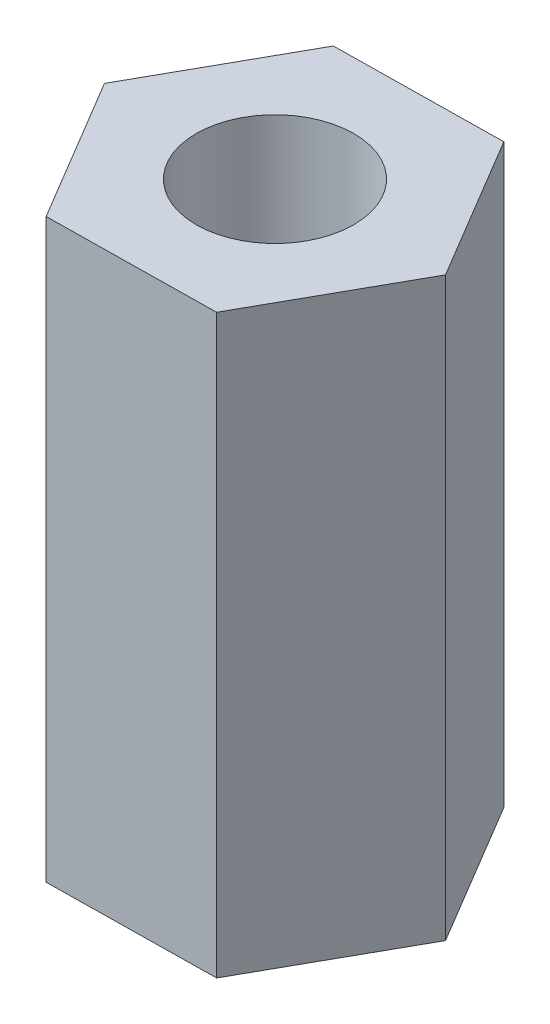
ISO-10303-21;
HEADER;
FILE_DESCRIPTION(('STEP AP214'),'2;1');
FILE_NAME('part.step','',(''),(''),'','','');
FILE_SCHEMA(('AUTOMOTIVE_DESIGN { 1 0 10303 214 1 1 1 1 }'));
ENDSEC;
DATA;
#1=APPLICATION_CONTEXT('core data for automotive mechanical design processes');
#2=APPLICATION_PROTOCOL_DEFINITION('international standard','automotive_design',2000,#1);
#3=PRODUCT_CONTEXT('',#1,'mechanical');
#4=PRODUCT('Part','Part','',(#3));
#5=PRODUCT_RELATED_PRODUCT_CATEGORY('part','',(#4));
#6=PRODUCT_DEFINITION_FORMATION('','',#4);
#7=PRODUCT_DEFINITION_CONTEXT('part definition',#1,'design');
#8=PRODUCT_DEFINITION('design','',#6,#7);
#9=PRODUCT_DEFINITION_SHAPE('','',#8);
#10=(LENGTH_UNIT() NAMED_UNIT(*) SI_UNIT(.MILLI.,.METRE.));
#11=(NAMED_UNIT(*) PLANE_ANGLE_UNIT() SI_UNIT($,.RADIAN.));
#12=(NAMED_UNIT(*) SI_UNIT($,.STERADIAN.) SOLID_ANGLE_UNIT());
#13=UNCERTAINTY_MEASURE_WITH_UNIT(LENGTH_MEASURE(1.E-05),#10,'distance_accuracy_value','');
#14=(GEOMETRIC_REPRESENTATION_CONTEXT(3) GLOBAL_UNCERTAINTY_ASSIGNED_CONTEXT((#13)) GLOBAL_UNIT_ASSIGNED_CONTEXT((#10,
#11,#12)) REPRESENTATION_CONTEXT('',''));
#15=CARTESIAN_POINT('',(0.,0.,0.));
#16=DIRECTION('',(0.,0.,1.));
#17=DIRECTION('',(1.,0.,0.));
#18=AXIS2_PLACEMENT_3D('',#15,#16,#17);
#19=CARTESIAN_POINT('',(-2.662841168,0.,0.01789337));
#20=DIRECTION('',(0.872922077182263,0.,0.487859659295379));
#21=DIRECTION('',(0.487859659295379,0.,-0.872922077182263));
#22=AXIS2_PLACEMENT_3D('',#19,#20,#21);
#23=PLANE('',#22);
#24=DIRECTION('',(-0.487859658772247,0.,0.872922077474632));
#25=VECTOR('',#24,1.);
#26=CARTESIAN_POINT('',(-1.31084482242684,9.5,-2.40121925173273));
#27=LINE('',#26,#25);
#28=CARTESIAN_POINT('',(-1.31084482207185,9.5,-2.4012192519232));
#29=VERTEX_POINT('',#28);
#30=CARTESIAN_POINT('',(-2.66284116763999,9.5,0.0178933696354591));
#31=VERTEX_POINT('',#30);
#32=EDGE_CURVE('E87',#29,#31,#27,.T.);
#33=ORIENTED_EDGE('',*,*,#32,.F.);
#34=DIRECTION('',(0.,1.,0.));
#35=VECTOR('',#34,1.);
#36=CARTESIAN_POINT('',(-1.31084482243029,0.,-2.40121925198003));
#37=LINE('',#36,#35);
#38=CARTESIAN_POINT('',(-1.31084482135757,0.,-2.40121925199501));
#39=VERTEX_POINT('',#38);
#40=EDGE_CURVE('E78',#29,#39,#37,.F.);
#41=ORIENTED_EDGE('',*,*,#40,.T.);
#42=DIRECTION('',(-0.487859659295379,0.,0.872922077182263));
#43=VECTOR('',#42,1.);
#44=CARTESIAN_POINT('',(-1.310844821,0.,-2.401219252));
#45=LINE('',#44,#43);
#46=CARTESIAN_POINT('',(-2.66284116783938,0.,0.0178933697126042));
#47=VERTEX_POINT('',#46);
#48=EDGE_CURVE('E106',#39,#47,#45,.T.);
#49=ORIENTED_EDGE('',*,*,#48,.T.);
#50=DIRECTION('',(0.,1.,0.));
#51=VECTOR('',#50,1.);
#52=CARTESIAN_POINT('',(-2.662841168,0.,0.01789337));
#53=LINE('',#52,#51);
#54=EDGE_CURVE('E101',#47,#31,#53,.T.);
#55=ORIENTED_EDGE('',*,*,#54,.T.);
#56=EDGE_LOOP('',(#33,#41,#49,#55));
#57=FACE_BOUND('',#56,.T.);
#58=ADVANCED_FACE('F17',(#57),#23,.F.);
#59=CARTESIAN_POINT('',(-1.243826356,0.,2.398312863));
#60=DIRECTION('',(0.858959896954844,0.,-0.512042864830009));
#61=DIRECTION('',(-0.512042864830009,0.,-0.858959896954844));
#62=AXIS2_PLACEMENT_3D('',#59,#60,#61);
#63=PLANE('',#62);
#64=DIRECTION('',(0.512042864372444,0.,0.858959897227608));
#65=VECTOR('',#64,1.);
#66=CARTESIAN_POINT('',(-2.66284116720243,9.5,0.0178933696914191));
#67=LINE('',#66,#65);
#68=CARTESIAN_POINT('',(-1.24382635660465,9.5,2.39831286229483));
#69=VERTEX_POINT('',#68);
#70=EDGE_CURVE('E89',#31,#69,#67,.T.);
#71=ORIENTED_EDGE('',*,*,#70,.F.);
#72=ORIENTED_EDGE('',*,*,#54,.F.);
#73=DIRECTION('',(0.512042864830009,0.,0.858959896954844));
#74=VECTOR('',#73,1.);
#75=CARTESIAN_POINT('',(-2.662841168,0.,0.01789337));
#76=LINE('',#75,#74);
#77=CARTESIAN_POINT('',(-1.24382635631245,0.,2.39831286247585));
#78=VERTEX_POINT('',#77);
#79=EDGE_CURVE('E117',#47,#78,#76,.T.);
#80=ORIENTED_EDGE('',*,*,#79,.T.);
#81=DIRECTION('',(0.,1.,0.));
#82=VECTOR('',#81,1.);
#83=CARTESIAN_POINT('',(-1.243826356,0.,2.398312863));
#84=LINE('',#83,#82);
#85=EDGE_CURVE('E98',#78,#69,#84,.T.);
#86=ORIENTED_EDGE('',*,*,#85,.T.);
#87=EDGE_LOOP('',(#71,#72,#80,#86));
#88=FACE_BOUND('',#87,.T.);
#89=ADVANCED_FACE('F110',(#88),#63,.F.);
#90=CARTESIAN_POINT('',(1.527184803,0.,2.359619734));
#91=DIRECTION('',(-0.0139621802760672,0.,-0.999902524010185));
#92=DIRECTION('',(-0.999902524010185,0.,0.0139621802760672));
#93=AXIS2_PLACEMENT_3D('',#90,#91,#92);
#94=PLANE('',#93);
#95=DIRECTION('',(0.99990252401113,0.,-0.0139621802084121));
#96=VECTOR('',#95,1.);
#97=CARTESIAN_POINT('',(-1.24382635716877,9.5,2.39831286227592));
#98=LINE('',#97,#96);
#99=CARTESIAN_POINT('',(1.52718480385565,9.5,2.35961973384983));
#100=VERTEX_POINT('',#99);
#101=EDGE_CURVE('E112',#69,#100,#98,.T.);
#102=ORIENTED_EDGE('',*,*,#101,.F.);
#103=ORIENTED_EDGE('',*,*,#85,.F.);
#104=DIRECTION('',(0.999902524010185,0.,-0.0139621802760672));
#105=VECTOR('',#104,1.);
#106=CARTESIAN_POINT('',(-1.243826356,0.,2.398312863));
#107=LINE('',#106,#105);
#108=CARTESIAN_POINT('',(1.52718480357172,0.,2.35961973399202));
#109=VERTEX_POINT('',#108);
#110=EDGE_CURVE('E119',#78,#109,#107,.T.);
#111=ORIENTED_EDGE('',*,*,#110,.T.);
#112=DIRECTION('',(0.,1.,0.));
#113=VECTOR('',#112,1.);
#114=CARTESIAN_POINT('',(1.527184803,0.,2.359619734));
#115=LINE('',#114,#113);
#116=EDGE_CURVE('E95',#109,#100,#115,.T.);
#117=ORIENTED_EDGE('',*,*,#116,.T.);
#118=EDGE_LOOP('',(#102,#103,#111,#117));
#119=FACE_BOUND('',#118,.T.);
#120=ADVANCED_FACE('F152',(#119),#94,.F.);
#121=CARTESIAN_POINT('',(2.879181149,0.,-0.059492888));
#122=DIRECTION('',(-0.872922077335933,0.,-0.487859659020419));
#123=DIRECTION('',(-0.487859659020419,0.,0.872922077335933));
#124=AXIS2_PLACEMENT_3D('',#121,#122,#123);
#125=PLANE('',#124);
#126=DIRECTION('',(0.487859658565047,0.,-0.872922077590432));
#127=VECTOR('',#126,1.);
#128=CARTESIAN_POINT('',(1.52718480413572,9.5,2.35961973343126));
#129=LINE('',#128,#127);
#130=CARTESIAN_POINT('',(2.87918114873376,9.5,-0.0594928878985866));
#131=VERTEX_POINT('',#130);
#132=EDGE_CURVE('E76',#100,#131,#129,.T.);
#133=ORIENTED_EDGE('',*,*,#132,.F.);
#134=ORIENTED_EDGE('',*,*,#116,.F.);
#135=DIRECTION('',(0.487859659020419,0.,-0.872922077335933));
#136=VECTOR('',#135,1.);
#137=CARTESIAN_POINT('',(1.527184803,0.,2.359619734));
#138=LINE('',#137,#136);
#139=CARTESIAN_POINT('',(2.87918114889344,0.,-0.0594928878093396));
#140=VERTEX_POINT('',#139);
#141=EDGE_CURVE('E122',#109,#140,#138,.T.);
#142=ORIENTED_EDGE('',*,*,#141,.T.);
#143=DIRECTION('',(0.,1.,0.));
#144=VECTOR('',#143,1.);
#145=CARTESIAN_POINT('',(2.879181149,0.,-0.0594928880000003));
#146=LINE('',#145,#144);
#147=EDGE_CURVE('E66',#140,#131,#146,.T.);
#148=ORIENTED_EDGE('',*,*,#147,.T.);
#149=EDGE_LOOP('',(#133,#134,#142,#148));
#150=FACE_BOUND('',#149,.T.);
#151=ADVANCED_FACE('F149',(#150),#125,.F.);
#152=CARTESIAN_POINT('',(1.460166337,0.,-2.439912381));
#153=DIRECTION('',(-0.858959896954844,0.,0.512042864830009));
#154=DIRECTION('',(0.512042864830009,0.,0.858959896954844));
#155=AXIS2_PLACEMENT_3D('',#152,#153,#154);
#156=PLANE('',#155);
#157=DIRECTION('',(-0.512042864415967,0.,-0.858959897201663));
#158=VECTOR('',#157,1.);
#159=CARTESIAN_POINT('',(2.87918114814814,9.5,-0.0594928879756656));
#160=LINE('',#159,#158);
#161=CARTESIAN_POINT('',(1.46016633748832,9.5,-2.43991238046971));
#162=VERTEX_POINT('',#161);
#163=EDGE_CURVE('E72',#131,#162,#160,.T.);
#164=ORIENTED_EDGE('',*,*,#163,.F.);
#165=ORIENTED_EDGE('',*,*,#147,.F.);
#166=DIRECTION('',(-0.512042864830009,0.,-0.858959896954845));
#167=VECTOR('',#166,1.);
#168=CARTESIAN_POINT('',(2.879181149,0.,-0.0594928879999995));
#169=LINE('',#168,#167);
#170=CARTESIAN_POINT('',(1.46016633724085,0.,-2.43991238059598));
#171=VERTEX_POINT('',#170);
#172=EDGE_CURVE('E83',#140,#171,#169,.T.);
#173=ORIENTED_EDGE('',*,*,#172,.T.);
#174=DIRECTION('',(0.,1.,0.));
#175=VECTOR('',#174,1.);
#176=CARTESIAN_POINT('',(1.460166337,0.,-2.439912381));
#177=LINE('',#176,#175);
#178=EDGE_CURVE('E33',#171,#162,#177,.T.);
#179=ORIENTED_EDGE('',*,*,#178,.T.);
#180=EDGE_LOOP('',(#164,#165,#173,#179));
#181=FACE_BOUND('',#180,.T.);
#182=ADVANCED_FACE('F81',(#181),#156,.F.);
#183=CARTESIAN_POINT('',(-1.310844821,0.,-2.401219252));
#184=DIRECTION('',(0.0139621802811045,0.,0.999902524010115));
#185=DIRECTION('',(0.999902524010115,0.,-0.0139621802811045));
#186=AXIS2_PLACEMENT_3D('',#183,#184,#185);
#187=PLANE('',#186);
#188=DIRECTION('',(-0.999902524011483,0.,0.0139621801831299));
#189=VECTOR('',#188,1.);
#190=CARTESIAN_POINT('',(1.4601663379899,9.5,-2.43991238049491));
#191=LINE('',#190,#189);
#192=EDGE_CURVE('E74',#162,#29,#191,.T.);
#193=ORIENTED_EDGE('',*,*,#192,.F.);
#194=ORIENTED_EDGE('',*,*,#178,.F.);
#195=DIRECTION('',(-0.999902524010115,0.,0.0139621802811047));
#196=VECTOR('',#195,1.);
#197=CARTESIAN_POINT('',(1.460166337,0.,-2.439912381));
#198=LINE('',#197,#196);
#199=EDGE_CURVE('E125',#171,#39,#198,.T.);
#200=ORIENTED_EDGE('',*,*,#199,.T.);
#201=ORIENTED_EDGE('',*,*,#40,.F.);
#202=EDGE_LOOP('',(#193,#194,#200,#201));
#203=FACE_BOUND('',#202,.T.);
#204=ADVANCED_FACE('F85',(#203),#187,.F.);
#205=CARTESIAN_POINT('',(-2.696093302,9.5,-2.468941733));
#206=DIRECTION('',(0.,1.,0.));
#207=DIRECTION('',(0.,0.,1.));
#208=AXIS2_PLACEMENT_3D('',#205,#206,#207);
#209=PLANE('',#208);
#210=CARTESIAN_POINT('',(0.108169991,9.5,-0.020799759));
#211=DIRECTION('',(0.,1.,0.));
#212=DIRECTION('',(0.,0.,1.));
#213=AXIS2_PLACEMENT_3D('',#210,#211,#212);
#214=CIRCLE('',#213,1.3);
#215=CARTESIAN_POINT('',(0.108169991,9.5,1.279200241));
#216=VERTEX_POINT('',#215);
#217=EDGE_CURVE('E20',#216,#216,#214,.F.);
#218=ORIENTED_EDGE('',*,*,#217,.T.);
#219=EDGE_LOOP('',(#218));
#220=FACE_BOUND('',#219,.T.);
#221=ORIENTED_EDGE('',*,*,#101,.T.);
#222=ORIENTED_EDGE('',*,*,#132,.T.);
#223=ORIENTED_EDGE('',*,*,#163,.T.);
#224=ORIENTED_EDGE('',*,*,#192,.T.);
#225=ORIENTED_EDGE('',*,*,#32,.T.);
#226=ORIENTED_EDGE('',*,*,#70,.T.);
#227=EDGE_LOOP('',(#221,#222,#223,#224,#225,#226));
#228=FACE_BOUND('',#227,.T.);
#229=ADVANCED_FACE('F73',(#220,#228),#209,.T.);
#230=CARTESIAN_POINT('',(-2.696093302,0.,-2.468941733));
#231=DIRECTION('',(0.,1.,0.));
#232=DIRECTION('',(0.,0.,1.));
#233=AXIS2_PLACEMENT_3D('',#230,#231,#232);
#234=PLANE('',#233);
#235=CARTESIAN_POINT('',(0.108169991,0.,-0.020799759));
#236=DIRECTION('',(0.,1.,0.));
#237=DIRECTION('',(0.,0.,1.));
#238=AXIS2_PLACEMENT_3D('',#235,#236,#237);
#239=CIRCLE('',#238,1.3);
#240=CARTESIAN_POINT('',(0.108169991,0.,1.279200241));
#241=VERTEX_POINT('',#240);
#242=EDGE_CURVE('E11',#241,#241,#239,.T.);
#243=ORIENTED_EDGE('',*,*,#242,.T.);
#244=EDGE_LOOP('',(#243));
#245=FACE_BOUND('',#244,.T.);
#246=ORIENTED_EDGE('',*,*,#172,.F.);
#247=ORIENTED_EDGE('',*,*,#141,.F.);
#248=ORIENTED_EDGE('',*,*,#110,.F.);
#249=ORIENTED_EDGE('',*,*,#79,.F.);
#250=ORIENTED_EDGE('',*,*,#48,.F.);
#251=ORIENTED_EDGE('',*,*,#199,.F.);
#252=EDGE_LOOP('',(#246,#247,#248,#249,#250,#251));
#253=FACE_BOUND('',#252,.T.);
#254=ADVANCED_FACE('F132',(#245,#253),#234,.F.);
#255=CARTESIAN_POINT('',(0.108169991,9.5,-0.020799759));
#256=DIRECTION('',(0.,1.,0.));
#257=DIRECTION('',(0.,0.,1.));
#258=AXIS2_PLACEMENT_3D('',#255,#256,#257);
#259=CYLINDRICAL_SURFACE('',#258,1.3);
#260=ORIENTED_EDGE('',*,*,#242,.F.);
#261=EDGE_LOOP('',(#260));
#262=FACE_BOUND('',#261,.T.);
#263=ORIENTED_EDGE('',*,*,#217,.F.);
#264=EDGE_LOOP('',(#263));
#265=FACE_BOUND('',#264,.T.);
#266=ADVANCED_FACE('F130',(#262,#265),#259,.F.);
#267=CLOSED_SHELL('',(#58,#89,#120,#151,#182,#204,#229,#254,#266));
#268=MANIFOLD_SOLID_BREP('B1',#267);
#269=ADVANCED_BREP_SHAPE_REPRESENTATION('',(#18,#268),#14);
#270=SHAPE_DEFINITION_REPRESENTATION(#9,#269);
ENDSEC;
END-ISO-10303-21;
